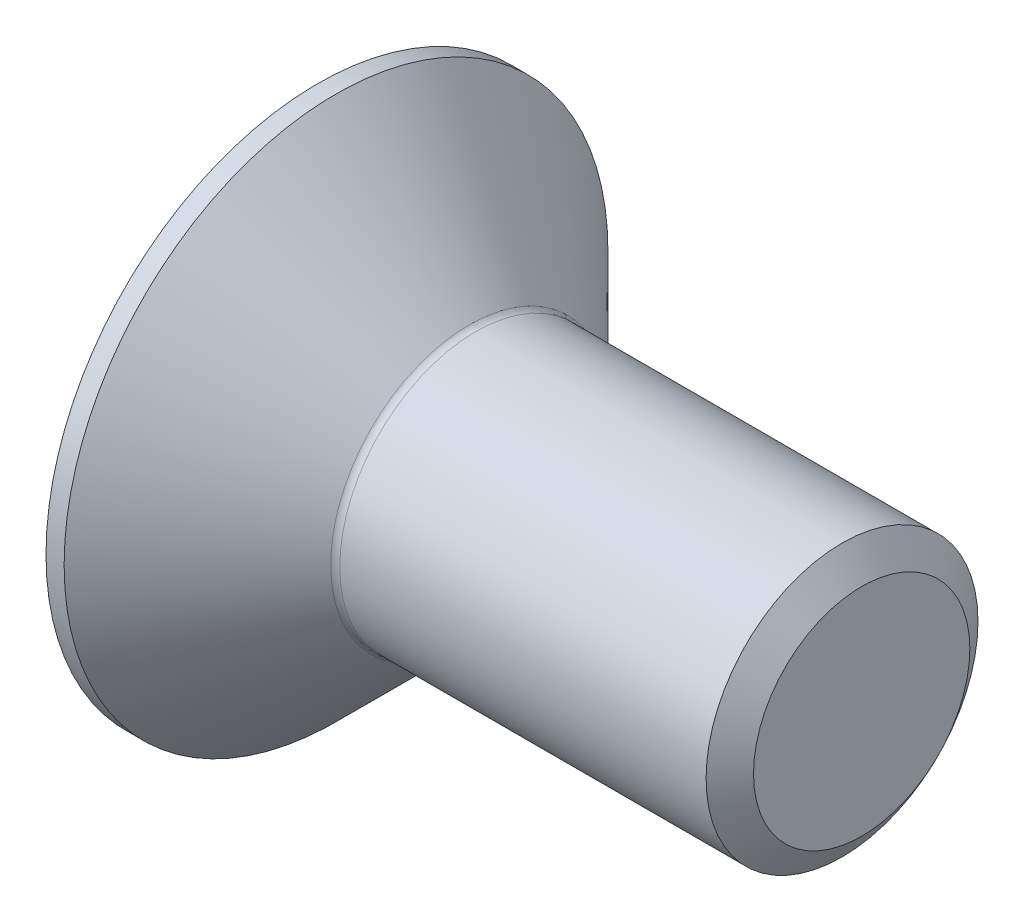
ISO-10303-21;
HEADER;
FILE_DESCRIPTION(('STEP AP214'),'2;1');
FILE_NAME('part.step','',(''),(''),'','','');
FILE_SCHEMA(('AUTOMOTIVE_DESIGN { 1 0 10303 214 1 1 1 1 }'));
ENDSEC;
DATA;
#1=APPLICATION_CONTEXT('core data for automotive mechanical design processes');
#2=APPLICATION_PROTOCOL_DEFINITION('international standard','automotive_design',2000,#1);
#3=PRODUCT_CONTEXT('',#1,'mechanical');
#4=PRODUCT('Part','Part','',(#3));
#5=PRODUCT_RELATED_PRODUCT_CATEGORY('part','',(#4));
#6=PRODUCT_DEFINITION_FORMATION('','',#4);
#7=PRODUCT_DEFINITION_CONTEXT('part definition',#1,'design');
#8=PRODUCT_DEFINITION('design','',#6,#7);
#9=PRODUCT_DEFINITION_SHAPE('','',#8);
#10=(LENGTH_UNIT() NAMED_UNIT(*) SI_UNIT(.MILLI.,.METRE.));
#11=(NAMED_UNIT(*) PLANE_ANGLE_UNIT() SI_UNIT($,.RADIAN.));
#12=(NAMED_UNIT(*) SI_UNIT($,.STERADIAN.) SOLID_ANGLE_UNIT());
#13=UNCERTAINTY_MEASURE_WITH_UNIT(LENGTH_MEASURE(1.E-05),#10,'distance_accuracy_value','');
#14=(GEOMETRIC_REPRESENTATION_CONTEXT(3) GLOBAL_UNCERTAINTY_ASSIGNED_CONTEXT((#13)) GLOBAL_UNIT_ASSIGNED_CONTEXT((#10,
#11,#12)) REPRESENTATION_CONTEXT('',''));
#15=CARTESIAN_POINT('',(0.,0.,0.));
#16=DIRECTION('',(0.,0.,1.));
#17=DIRECTION('',(1.,0.,0.));
#18=AXIS2_PLACEMENT_3D('',#15,#16,#17);
#19=CARTESIAN_POINT('',(1.480072615584,0.,0.));
#20=DIRECTION('',(-1.,0.,0.));
#21=DIRECTION('',(0.,0.,-1.));
#22=AXIS2_PLACEMENT_3D('',#19,#20,#21);
#23=CONICAL_SURFACE('',#22,0.5049,1.0471975511964);
#24=CARTESIAN_POINT('',(1.2,0.,0.));
#25=DIRECTION('',(1.,0.,0.));
#26=DIRECTION('',(0.,0.,1.));
#27=AXIS2_PLACEMENT_3D('',#24,#25,#26);
#28=CIRCLE('',#27,0.99);
#29=CARTESIAN_POINT('',(1.2,0.,0.99));
#30=VERTEX_POINT('',#29);
#31=EDGE_CURVE('E194',#30,#30,#28,.T.);
#32=ORIENTED_EDGE('',*,*,#31,.F.);
#33=EDGE_LOOP('',(#32));
#34=FACE_BOUND('',#33,.T.);
#35=CARTESIAN_POINT('',(1.771576766498,0.,0.));
#36=VERTEX_POINT('',#35);
#37=VERTEX_LOOP('',#36);
#38=FACE_BOUND('',#37,.T.);
#39=ADVANCED_FACE('F17',(#34,#38),#23,.F.);
#40=CARTESIAN_POINT('',(1.2,0.,0.));
#41=DIRECTION('',(1.,0.,0.));
#42=DIRECTION('',(0.,1.,0.));
#43=AXIS2_PLACEMENT_3D('',#40,#41,#42);
#44=PLANE('',#43);
#45=DIRECTION('',(0.,-0.498487739753809,-0.866896748935615));
#46=VECTOR('',#45,1.);
#47=CARTESIAN_POINT('',(1.2,1.15469877967,0.002015331603751));
#48=LINE('',#47,#46);
#49=CARTESIAN_POINT('',(1.2,1.15469877967,0.002015331603751));
#50=VERTEX_POINT('',#49);
#51=CARTESIAN_POINT('',(1.2,0.579094718201,-0.9989908111114));
#52=VERTEX_POINT('',#51);
#53=EDGE_CURVE('E11',#50,#52,#48,.T.);
#54=ORIENTED_EDGE('',*,*,#53,.T.);
#55=DIRECTION('',(0.,0.999998476913288,0.00174532836589698));
#56=VECTOR('',#55,1.);
#57=CARTESIAN_POINT('',(1.2,-0.5756040614692,-1.001006142715));
#58=LINE('',#57,#56);
#59=CARTESIAN_POINT('',(1.2,-0.5756040614692,-1.001006142715));
#60=VERTEX_POINT('',#59);
#61=EDGE_CURVE('E91',#60,#52,#58,.T.);
#62=ORIENTED_EDGE('',*,*,#61,.F.);
#63=DIRECTION('',(0.,-0.501510737159491,0.865151420569685));
#64=VECTOR('',#63,1.);
#65=CARTESIAN_POINT('',(1.2,-0.5756040614692,-1.001006142715));
#66=LINE('',#65,#64);
#67=CARTESIAN_POINT('',(1.2,-1.15469877967,-0.002015331603752));
#68=VERTEX_POINT('',#67);
#69=EDGE_CURVE('E32',#60,#68,#66,.T.);
#70=ORIENTED_EDGE('',*,*,#69,.T.);
#71=DIRECTION('',(0.,0.498487739753809,0.866896748935615));
#72=VECTOR('',#71,1.);
#73=CARTESIAN_POINT('',(1.2,-1.15469877967,-0.002015331603752));
#74=LINE('',#73,#72);
#75=CARTESIAN_POINT('',(1.2,-0.579094718201,0.9989908111114));
#76=VERTEX_POINT('',#75);
#77=EDGE_CURVE('E205',#68,#76,#74,.T.);
#78=ORIENTED_EDGE('',*,*,#77,.T.);
#79=DIRECTION('',(0.,-0.999998476913288,-0.00174532836589698));
#80=VECTOR('',#79,1.);
#81=CARTESIAN_POINT('',(1.2,0.5756040614692,1.001006142715));
#82=LINE('',#81,#80);
#83=CARTESIAN_POINT('',(1.2,0.5756040614692,1.001006142715));
#84=VERTEX_POINT('',#83);
#85=EDGE_CURVE('E106',#84,#76,#82,.T.);
#86=ORIENTED_EDGE('',*,*,#85,.F.);
#87=DIRECTION('',(0.,0.501510737159491,-0.865151420569685));
#88=VECTOR('',#87,1.);
#89=CARTESIAN_POINT('',(1.2,0.5756040614692,1.001006142715));
#90=LINE('',#89,#88);
#91=EDGE_CURVE('E201',#84,#50,#90,.T.);
#92=ORIENTED_EDGE('',*,*,#91,.T.);
#93=EDGE_LOOP('',(#54,#62,#70,#78,#86,#92));
#94=FACE_BOUND('',#93,.T.);
#95=ORIENTED_EDGE('',*,*,#31,.T.);
#96=EDGE_LOOP('',(#95));
#97=FACE_BOUND('',#96,.T.);
#98=ADVANCED_FACE('F211',(#94,#97),#44,.F.);
#99=CARTESIAN_POINT('',(0.,0.5756040614692,1.001006142715));
#100=DIRECTION('',(0.,0.865151420569685,0.501510737159491));
#101=DIRECTION('',(1.,0.,0.));
#102=AXIS2_PLACEMENT_3D('',#99,#100,#101);
#103=PLANE('',#102);
#104=DIRECTION('',(-1.,0.,0.));
#105=VECTOR('',#104,1.);
#106=CARTESIAN_POINT('',(1.2,1.15469877967,0.002015331603751));
#107=LINE('',#106,#105);
#108=CARTESIAN_POINT('',(0.0577350269188932,1.15469877967005,0.00201533160380936));
#109=VERTEX_POINT('',#108);
#110=EDGE_CURVE('E101',#50,#109,#107,.T.);
#111=ORIENTED_EDGE('',*,*,#110,.F.);
#112=ORIENTED_EDGE('',*,*,#91,.F.);
#113=DIRECTION('',(-1.,0.,0.));
#114=VECTOR('',#113,1.);
#115=CARTESIAN_POINT('',(1.2,0.5756040614692,1.001006142715));
#116=LINE('',#115,#114);
#117=CARTESIAN_POINT('',(0.057735026918927,0.575604061469208,1.00100614271499));
#118=VERTEX_POINT('',#117);
#119=EDGE_CURVE('E189',#84,#118,#116,.T.);
#120=ORIENTED_EDGE('',*,*,#119,.T.);
#121=CARTESIAN_POINT('',(0.0577350269188477,1.15469877967009,0.00201533160386764));
#122=CARTESIAN_POINT('',(0.077559727233772,1.13479498406907,0.0363511807952168));
#123=CARTESIAN_POINT('',(0.0962199932947419,1.11455843799374,0.0712610546767922));
#124=CARTESIAN_POINT('',(0.130386150043151,1.073294043532,0.142445870558753));
#125=CARTESIAN_POINT('',(0.145873036943601,1.05226227304212,0.178727578542655));
#126=CARTESIAN_POINT('',(0.172401986583303,1.00985265669143,0.251888005853613));
#127=CARTESIAN_POINT('',(0.183510714367633,0.988485606753085,0.288748101237095));
#128=CARTESIAN_POINT('',(0.200626540027817,0.945281567159923,0.363278980556008));
#129=CARTESIAN_POINT('',(0.206646407098901,0.923445895568999,0.4009474907119));
#130=CARTESIAN_POINT('',(0.212076142182217,0.885809051785995,0.465874453291107));
#131=CARTESIAN_POINT('',(0.212878460008744,0.870056755404791,0.493048590516207));
#132=CARTESIAN_POINT('',(0.21152624718964,0.83858272357361,0.547344144593532));
#133=CARTESIAN_POINT('',(0.209371063384536,0.822860995642601,0.574465548474855));
#134=CARTESIAN_POINT('',(0.198611707237915,0.775920436563805,0.655442262152752));
#135=CARTESIAN_POINT('',(0.185712518726653,0.74493527327832,0.708894473734209));
#136=CARTESIAN_POINT('',(0.154597346322252,0.690575940470048,0.802669243675655));
#137=CARTESIAN_POINT('',(0.138018039193724,0.666945904222823,0.843433195297489));
#138=CARTESIAN_POINT('',(0.10067374195193,0.620610608753016,0.923365774458743));
#139=CARTESIAN_POINT('',(0.0799223772754691,0.597902621140093,0.962539108718486));
#140=CARTESIAN_POINT('',(0.057735026918894,0.575604061469216,1.00100614271497));
#141=B_SPLINE_CURVE_WITH_KNOTS('',3,(#121,#122,#123,#124,#125,#126,#127,#128,#129,#130,#131,
#132,#133,#134,#135,#136,#137,#138,#139,#140),.UNSPECIFIED.,.F.,.F.,(4,2,2,2,2,2,2,2,2,4),(0.,
0.133182946580626,0.267141541466163,0.398973326814598,0.530473323702635,0.624596460448177,
0.718740387482565,0.907081600587103,1.05673041329857,1.20589820623488),.UNSPECIFIED.);
#142=EDGE_CURVE('E118',#109,#118,#141,.T.);
#143=ORIENTED_EDGE('',*,*,#142,.F.);
#144=EDGE_LOOP('',(#111,#112,#120,#143));
#145=FACE_BOUND('',#144,.T.);
#146=ADVANCED_FACE('F215',(#145),#103,.F.);
#147=CARTESIAN_POINT('',(0.10622119061,0.,0.));
#148=DIRECTION('',(-1.,0.,0.));
#149=DIRECTION('',(0.,0.,-1.));
#150=AXIS2_PLACEMENT_3D('',#147,#148,#149);
#151=CONICAL_SURFACE('',#150,1.106214374688,0.7853981633973);
#152=CARTESIAN_POINT('',(0.05773502691896,-0.5756040614692,-1.001006142715));
#153=CARTESIAN_POINT('',(0.07118968526329,-0.5486947857658,-1.000959177121));
#154=CARTESIAN_POINT('',(0.09614732009917,-0.495942137485,-1.000867106288));
#155=CARTESIAN_POINT('',(0.1276733223624,-0.4204644424806,-1.000735372725));
#156=CARTESIAN_POINT('',(0.1539245365825,-0.3475119025953,-1.000608046394));
#157=CARTESIAN_POINT('',(0.1751905707173,-0.2764847830984,-1.000484080559));
#158=CARTESIAN_POINT('',(0.1917452179942,-0.20647649285,-1.000361892918));
#159=CARTESIAN_POINT('',(0.203586614247,-0.137282448769,-1.000241126406));
#160=CARTESIAN_POINT('',(0.2107470808932,-0.06856622754632,-1.000121193853));
#161=CARTESIAN_POINT('',(0.2123941972009,-0.02282948491354,-1.000041368097));
#162=CARTESIAN_POINT('',(0.2124340422092,0.,-1.000001523089));
#163=B_SPLINE_CURVE_WITH_KNOTS('',3,(#152,#153,#154,#155,#156,#157,#158,#159,#160,#161,#162),
.UNSPECIFIED.,.F.,.F.,(4,1,1,1,1,1,1,1,4),(0.,0.125,0.25,0.375,0.5,0.625,0.75,0.875,1.),.UNSPECIFIED.);
#164=CARTESIAN_POINT('',(0.057735026918927,-0.575604061469208,-1.00100614271499));
#165=VERTEX_POINT('',#164);
#166=CARTESIAN_POINT('',(0.2124340422092,0.,-1.000001523089));
#167=VERTEX_POINT('',#166);
#168=EDGE_CURVE('E84',#165,#167,#163,.T.);
#169=ORIENTED_EDGE('',*,*,#168,.T.);
#170=CARTESIAN_POINT('',(0.2124340422092,0.,-1.000001523089));
#171=CARTESIAN_POINT('',(0.2124741423863,0.02297568572132,-0.999961422912));
#172=CARTESIAN_POINT('',(0.2109670804407,0.06900195194868,-0.9998810918416));
#173=CARTESIAN_POINT('',(0.2039553097016,0.1381456082402,-0.9997604132731));
#174=CARTESIAN_POINT('',(0.1922040935389,0.207754728814,-0.9996389223154));
#175=CARTESIAN_POINT('',(0.1756788116017,0.278185440732,-0.9995159974088));
#176=CARTESIAN_POINT('',(0.1543866020178,0.34962738603,-0.9993913075653));
#177=CARTESIAN_POINT('',(0.1280502319764,0.4230088263277,-0.9992632326609));
#178=CARTESIAN_POINT('',(0.09637834225902,0.4989345562618,-0.9991307171289));
#179=CARTESIAN_POINT('',(0.07127465250391,0.5520155082751,-0.9990380732966));
#180=CARTESIAN_POINT('',(0.05773502691896,0.579094718201,-0.9989908111114));
#181=B_SPLINE_CURVE_WITH_KNOTS('',3,(#170,#171,#172,#173,#174,#175,#176,#177,#178,#179,#180),
.UNSPECIFIED.,.F.,.F.,(4,1,1,1,1,1,1,1,4),(0.,0.125,0.25,0.375,0.5,0.625,0.75,0.875,1.),.UNSPECIFIED.);
#182=CARTESIAN_POINT('',(0.0577350269189231,0.579094718200948,-0.998990811111349));
#183=VERTEX_POINT('',#182);
#184=EDGE_CURVE('E89',#167,#183,#181,.T.);
#185=ORIENTED_EDGE('',*,*,#184,.T.);
#186=CARTESIAN_POINT('',(0.0577350269188862,0.579094718200895,-0.998990811111297));
#187=CARTESIAN_POINT('',(0.0775597272338172,0.598878538060608,-0.964585693893403));
#188=CARTESIAN_POINT('',(0.0962199932947937,0.618993102647303,-0.929605393966522));
#189=CARTESIAN_POINT('',(0.130386150043215,0.660008764333935,-0.85827697214988));
#190=CARTESIAN_POINT('',(0.145873036943672,0.680913759895748,-0.821922070627128));
#191=CARTESIAN_POINT('',(0.172401986583384,0.72306774032342,-0.748614051847181));
#192=CARTESIAN_POINT('',(0.183510714367719,0.744305994342267,-0.711679596104901));
#193=CARTESIAN_POINT('',(0.200626540027911,0.787249609402265,-0.636998360611646));
#194=CARTESIAN_POINT('',(0.206646407098998,0.808953660324521,-0.59925385922726));
#195=CARTESIAN_POINT('',(0.212076142182316,0.846363637417177,-0.534195915103305));
#196=CARTESIAN_POINT('',(0.212878460008844,0.862020982389435,-0.506966957656694));
#197=CARTESIAN_POINT('',(0.211526247189741,0.893305295617358,-0.452561869492713));
#198=CARTESIAN_POINT('',(0.209371063384639,0.908932256399376,-0.425385751772412));
#199=CARTESIAN_POINT('',(0.19861170723802,0.955589868020014,-0.34424567830339));
#200=CARTESIAN_POINT('',(0.185712518726761,0.986388259495271,-0.290685633967027));
#201=CARTESIAN_POINT('',(0.154597346322356,1.04041992609448,-0.196721685851553));
#202=CARTESIAN_POINT('',(0.13801803919382,1.06390752563403,-0.155875498358174));
#203=CARTESIAN_POINT('',(0.100673741952005,1.1099635220428,-0.0757816658087999));
#204=CARTESIAN_POINT('',(0.0799223772755318,1.13253463085623,-0.036529304537298));
#205=CARTESIAN_POINT('',(0.0577350269189434,1.15469877967,0.00201533160374308));
#206=B_SPLINE_CURVE_WITH_KNOTS('',3,(#186,#187,#188,#189,#190,#191,#192,#193,#194,#195,#196,
#197,#198,#199,#200,#201,#202,#203,#204,#205),.UNSPECIFIED.,.F.,.F.,(4,2,2,2,2,2,2,2,2,4),(0.,
0.133182946580649,0.26714154146621,0.398973326814668,0.530473323702727,0.624596460448261,
0.718740387482642,0.907081600587164,1.0567304132987,1.20589820623508),.UNSPECIFIED.);
#207=EDGE_CURVE('E111',#183,#109,#206,.T.);
#208=ORIENTED_EDGE('',*,*,#207,.T.);
#209=ORIENTED_EDGE('',*,*,#142,.T.);
#210=CARTESIAN_POINT('',(0.05773502691896,0.5756040614692,1.001006142715));
#211=CARTESIAN_POINT('',(0.07118968526329,0.5486947857658,1.000959177121));
#212=CARTESIAN_POINT('',(0.09614732009917,0.495942137485,1.000867106288));
#213=CARTESIAN_POINT('',(0.1276733223624,0.4204644424806,1.000735372725));
#214=CARTESIAN_POINT('',(0.1539245365825,0.3475119025953,1.000608046394));
#215=CARTESIAN_POINT('',(0.1751905707173,0.2764847830984,1.000484080559));
#216=CARTESIAN_POINT('',(0.1917452179942,0.20647649285,1.000361892918));
#217=CARTESIAN_POINT('',(0.203586614247,0.137282448769,1.000241126406));
#218=CARTESIAN_POINT('',(0.2107470808932,0.06856622754629,1.000121193853));
#219=CARTESIAN_POINT('',(0.2123941972009,0.02282948491353,1.000041368097));
#220=CARTESIAN_POINT('',(0.2124340422092,0.,1.000001523089));
#221=B_SPLINE_CURVE_WITH_KNOTS('',3,(#210,#211,#212,#213,#214,#215,#216,#217,#218,#219,#220),
.UNSPECIFIED.,.F.,.F.,(4,1,1,1,1,1,1,1,4),(0.,0.125,0.25,0.375,0.5,0.625,0.75,0.875,1.),.UNSPECIFIED.);
#222=CARTESIAN_POINT('',(0.2124340422092,0.,1.000001523089));
#223=VERTEX_POINT('',#222);
#224=EDGE_CURVE('E143',#118,#223,#221,.T.);
#225=ORIENTED_EDGE('',*,*,#224,.T.);
#226=CARTESIAN_POINT('',(0.2124340422092,0.,1.000001523089));
#227=CARTESIAN_POINT('',(0.2124741423863,-0.02297568572133,0.999961422912));
#228=CARTESIAN_POINT('',(0.2109670804407,-0.0690019519487,0.9998810918416));
#229=CARTESIAN_POINT('',(0.2039553097016,-0.1381456082402,0.9997604132731));
#230=CARTESIAN_POINT('',(0.1922040935389,-0.207754728814,0.9996389223154));
#231=CARTESIAN_POINT('',(0.1756788116017,-0.278185440732,0.9995159974088));
#232=CARTESIAN_POINT('',(0.1543866020178,-0.34962738603,0.9993913075653));
#233=CARTESIAN_POINT('',(0.1280502319764,-0.4230088263277,0.9992632326609));
#234=CARTESIAN_POINT('',(0.09637834225902,-0.4989345562618,0.9991307171289));
#235=CARTESIAN_POINT('',(0.07127465250391,-0.5520155082751,0.9990380732966));
#236=CARTESIAN_POINT('',(0.05773502691896,-0.579094718201,0.9989908111114));
#237=B_SPLINE_CURVE_WITH_KNOTS('',3,(#226,#227,#228,#229,#230,#231,#232,#233,#234,#235,#236),
.UNSPECIFIED.,.F.,.F.,(4,1,1,1,1,1,1,1,4),(0.,0.125,0.25,0.375,0.5,0.625,0.75,0.875,1.),.UNSPECIFIED.);
#238=CARTESIAN_POINT('',(0.0577350269189231,-0.579094718200948,0.998990811111349));
#239=VERTEX_POINT('',#238);
#240=EDGE_CURVE('E142',#223,#239,#237,.T.);
#241=ORIENTED_EDGE('',*,*,#240,.T.);
#242=CARTESIAN_POINT('',(0.0577350269188862,-0.579094718200895,0.998990811111297));
#243=CARTESIAN_POINT('',(0.0775597272338172,-0.598878538060608,0.964585693893403));
#244=CARTESIAN_POINT('',(0.0962199932947937,-0.618993102647303,0.929605393966522));
#245=CARTESIAN_POINT('',(0.130386150043215,-0.660008764333935,0.85827697214988));
#246=CARTESIAN_POINT('',(0.145873036943672,-0.680913759895748,0.821922070627128));
#247=CARTESIAN_POINT('',(0.172401986583384,-0.72306774032342,0.748614051847181));
#248=CARTESIAN_POINT('',(0.183510714367719,-0.744305994342267,0.711679596104901));
#249=CARTESIAN_POINT('',(0.200626540027911,-0.787249609402265,0.636998360611646));
#250=CARTESIAN_POINT('',(0.206646407098998,-0.808953660324521,0.59925385922726));
#251=CARTESIAN_POINT('',(0.212076142182316,-0.846363637417177,0.534195915103305));
#252=CARTESIAN_POINT('',(0.212878460008844,-0.862020982389435,0.506966957656694));
#253=CARTESIAN_POINT('',(0.211526247189741,-0.893305295617358,0.452561869492713));
#254=CARTESIAN_POINT('',(0.209371063384639,-0.908932256399376,0.425385751772412));
#255=CARTESIAN_POINT('',(0.19861170723802,-0.955589868020014,0.34424567830339));
#256=CARTESIAN_POINT('',(0.185712518726761,-0.986388259495271,0.290685633967027));
#257=CARTESIAN_POINT('',(0.154597346322356,-1.04041992609448,0.196721685851553));
#258=CARTESIAN_POINT('',(0.13801803919382,-1.06390752563403,0.155875498358174));
#259=CARTESIAN_POINT('',(0.100673741952005,-1.1099635220428,0.0757816658087999));
#260=CARTESIAN_POINT('',(0.0799223772755318,-1.13253463085623,0.036529304537298));
#261=CARTESIAN_POINT('',(0.0577350269189434,-1.15469877967,-0.00201533160374308));
#262=B_SPLINE_CURVE_WITH_KNOTS('',3,(#242,#243,#244,#245,#246,#247,#248,#249,#250,#251,#252,
#253,#254,#255,#256,#257,#258,#259,#260,#261),.UNSPECIFIED.,.F.,.F.,(4,2,2,2,2,2,2,2,2,4),(0.,
0.133182946580649,0.26714154146621,0.398973326814668,0.530473323702727,0.624596460448261,
0.718740387482642,0.907081600587164,1.0567304132987,1.20589820623508),.UNSPECIFIED.);
#263=CARTESIAN_POINT('',(0.0577350269188955,-1.15469877967004,-0.00201533160380539));
#264=VERTEX_POINT('',#263);
#265=EDGE_CURVE('E96',#239,#264,#262,.T.);
#266=ORIENTED_EDGE('',*,*,#265,.T.);
#267=CARTESIAN_POINT('',(0.0577350269188477,-1.15469877967009,-0.00201533160386764));
#268=CARTESIAN_POINT('',(0.077559727233772,-1.13479498406907,-0.0363511807952168));
#269=CARTESIAN_POINT('',(0.0962199932947419,-1.11455843799374,-0.0712610546767922));
#270=CARTESIAN_POINT('',(0.130386150043151,-1.073294043532,-0.142445870558753));
#271=CARTESIAN_POINT('',(0.145873036943601,-1.05226227304212,-0.178727578542655));
#272=CARTESIAN_POINT('',(0.172401986583303,-1.00985265669143,-0.251888005853613));
#273=CARTESIAN_POINT('',(0.183510714367633,-0.988485606753085,-0.288748101237095));
#274=CARTESIAN_POINT('',(0.200626540027817,-0.945281567159923,-0.363278980556008));
#275=CARTESIAN_POINT('',(0.206646407098901,-0.923445895568999,-0.4009474907119));
#276=CARTESIAN_POINT('',(0.212076142182217,-0.885809051785995,-0.465874453291107));
#277=CARTESIAN_POINT('',(0.212878460008744,-0.870056755404791,-0.493048590516207));
#278=CARTESIAN_POINT('',(0.21152624718964,-0.83858272357361,-0.547344144593532));
#279=CARTESIAN_POINT('',(0.209371063384536,-0.822860995642601,-0.574465548474855));
#280=CARTESIAN_POINT('',(0.198611707237915,-0.775920436563805,-0.655442262152752));
#281=CARTESIAN_POINT('',(0.185712518726653,-0.74493527327832,-0.708894473734209));
#282=CARTESIAN_POINT('',(0.154597346322252,-0.690575940470048,-0.802669243675655));
#283=CARTESIAN_POINT('',(0.138018039193724,-0.666945904222823,-0.843433195297489));
#284=CARTESIAN_POINT('',(0.10067374195193,-0.620610608753016,-0.923365774458743));
#285=CARTESIAN_POINT('',(0.0799223772754691,-0.597902621140093,-0.962539108718486));
#286=CARTESIAN_POINT('',(0.057735026918894,-0.575604061469216,-1.00100614271497));
#287=B_SPLINE_CURVE_WITH_KNOTS('',3,(#267,#268,#269,#270,#271,#272,#273,#274,#275,#276,#277,
#278,#279,#280,#281,#282,#283,#284,#285,#286),.UNSPECIFIED.,.F.,.F.,(4,2,2,2,2,2,2,2,2,4),(0.,
0.133182946580626,0.267141541466163,0.398973326814598,0.530473323702635,0.624596460448177,
0.718740387482565,0.907081600587103,1.05673041329857,1.20589820623488),.UNSPECIFIED.);
#288=EDGE_CURVE('E21',#264,#165,#287,.T.);
#289=ORIENTED_EDGE('',*,*,#288,.T.);
#290=EDGE_LOOP('',(#169,#185,#208,#209,#225,#241,#266,#289));
#291=FACE_BOUND('',#290,.T.);
#292=CARTESIAN_POINT('',(0.,0.,0.));
#293=DIRECTION('',(1.,0.,0.));
#294=DIRECTION('',(0.,0.,-1.));
#295=AXIS2_PLACEMENT_3D('',#292,#293,#294);
#296=CIRCLE('',#295,1.212435565298);
#297=CARTESIAN_POINT('',(0.,0.,-1.212435565298));
#298=VERTEX_POINT('',#297);
#299=EDGE_CURVE('E163',#298,#298,#296,.T.);
#300=ORIENTED_EDGE('',*,*,#299,.F.);
#301=EDGE_LOOP('',(#300));
#302=FACE_BOUND('',#301,.T.);
#303=ADVANCED_FACE('F93',(#291,#302),#151,.F.);
#304=CARTESIAN_POINT('',(0.,0.579094718201,-0.9989908111114));
#305=DIRECTION('',(0.,0.00174532836589798,-0.999998476913288));
#306=DIRECTION('',(-1.,0.,0.));
#307=AXIS2_PLACEMENT_3D('',#304,#305,#306);
#308=PLANE('',#307);
#309=DIRECTION('',(-1.,0.,0.));
#310=VECTOR('',#309,1.);
#311=CARTESIAN_POINT('',(1.2,-0.5756040614692,-1.001006142715));
#312=LINE('',#311,#310);
#313=EDGE_CURVE('E86',#60,#165,#312,.T.);
#314=ORIENTED_EDGE('',*,*,#313,.F.);
#315=ORIENTED_EDGE('',*,*,#61,.T.);
#316=DIRECTION('',(-1.,0.,0.));
#317=VECTOR('',#316,1.);
#318=CARTESIAN_POINT('',(1.2,0.579094718201,-0.9989908111114));
#319=LINE('',#318,#317);
#320=EDGE_CURVE('E104',#52,#183,#319,.T.);
#321=ORIENTED_EDGE('',*,*,#320,.T.);
#322=ORIENTED_EDGE('',*,*,#184,.F.);
#323=ORIENTED_EDGE('',*,*,#168,.F.);
#324=EDGE_LOOP('',(#314,#315,#321,#322,#323));
#325=FACE_BOUND('',#324,.T.);
#326=ADVANCED_FACE('F85',(#325),#308,.F.);
#327=CARTESIAN_POINT('',(0.,1.15469877967,0.002015331603751));
#328=DIRECTION('',(0.,0.866896748935615,-0.498487739753809));
#329=DIRECTION('',(-1.,0.,0.));
#330=AXIS2_PLACEMENT_3D('',#327,#328,#329);
#331=PLANE('',#330);
#332=ORIENTED_EDGE('',*,*,#320,.F.);
#333=ORIENTED_EDGE('',*,*,#53,.F.);
#334=ORIENTED_EDGE('',*,*,#110,.T.);
#335=ORIENTED_EDGE('',*,*,#207,.F.);
#336=EDGE_LOOP('',(#332,#333,#334,#335));
#337=FACE_BOUND('',#336,.T.);
#338=ADVANCED_FACE('F125',(#337),#331,.F.);
#339=CARTESIAN_POINT('',(0.,-0.5756040614692,-1.001006142715));
#340=DIRECTION('',(0.,-0.865151420569685,-0.501510737159491));
#341=DIRECTION('',(0.,0.501510737159491,-0.865151420569685));
#342=AXIS2_PLACEMENT_3D('',#339,#340,#341);
#343=PLANE('',#342);
#344=DIRECTION('',(-1.,0.,0.));
#345=VECTOR('',#344,1.);
#346=CARTESIAN_POINT('',(1.2,-1.15469877967,-0.002015331603752));
#347=LINE('',#346,#345);
#348=EDGE_CURVE('E102',#68,#264,#347,.T.);
#349=ORIENTED_EDGE('',*,*,#348,.F.);
#350=ORIENTED_EDGE('',*,*,#69,.F.);
#351=ORIENTED_EDGE('',*,*,#313,.T.);
#352=ORIENTED_EDGE('',*,*,#288,.F.);
#353=EDGE_LOOP('',(#349,#350,#351,#352));
#354=FACE_BOUND('',#353,.T.);
#355=ADVANCED_FACE('F99',(#354),#343,.F.);
#356=CARTESIAN_POINT('',(0.,-1.15469877967,-0.002015331603751));
#357=DIRECTION('',(0.,-0.866896748935615,0.498487739753809));
#358=DIRECTION('',(-1.,0.,0.));
#359=AXIS2_PLACEMENT_3D('',#356,#357,#358);
#360=PLANE('',#359);
#361=DIRECTION('',(-1.,0.,0.));
#362=VECTOR('',#361,1.);
#363=CARTESIAN_POINT('',(1.2,-0.579094718201,0.9989908111114));
#364=LINE('',#363,#362);
#365=EDGE_CURVE('E154',#76,#239,#364,.T.);
#366=ORIENTED_EDGE('',*,*,#365,.F.);
#367=ORIENTED_EDGE('',*,*,#77,.F.);
#368=ORIENTED_EDGE('',*,*,#348,.T.);
#369=ORIENTED_EDGE('',*,*,#265,.F.);
#370=EDGE_LOOP('',(#366,#367,#368,#369));
#371=FACE_BOUND('',#370,.T.);
#372=ADVANCED_FACE('F132',(#371),#360,.F.);
#373=CARTESIAN_POINT('',(0.,-0.579094718201,0.9989908111114));
#374=DIRECTION('',(0.,-0.00174532836589798,0.999998476913288));
#375=DIRECTION('',(-1.,0.,0.));
#376=AXIS2_PLACEMENT_3D('',#373,#374,#375);
#377=PLANE('',#376);
#378=ORIENTED_EDGE('',*,*,#119,.F.);
#379=ORIENTED_EDGE('',*,*,#85,.T.);
#380=ORIENTED_EDGE('',*,*,#365,.T.);
#381=ORIENTED_EDGE('',*,*,#240,.F.);
#382=ORIENTED_EDGE('',*,*,#224,.F.);
#383=EDGE_LOOP('',(#378,#379,#380,#381,#382));
#384=FACE_BOUND('',#383,.T.);
#385=ADVANCED_FACE('F136',(#384),#377,.F.);
#386=CARTESIAN_POINT('',(0.,0.,-2.106217782649));
#387=DIRECTION('',(-1.,0.,0.));
#388=DIRECTION('',(0.,0.,1.));
#389=AXIS2_PLACEMENT_3D('',#386,#387,#388);
#390=PLANE('',#389);
#391=CARTESIAN_POINT('',(0.,0.,0.));
#392=DIRECTION('',(-1.,0.,0.));
#393=DIRECTION('',(0.,0.,1.));
#394=AXIS2_PLACEMENT_3D('',#391,#392,#393);
#395=CIRCLE('',#394,3.);
#396=CARTESIAN_POINT('',(0.,0.,3.));
#397=VERTEX_POINT('',#396);
#398=EDGE_CURVE('E158',#397,#397,#395,.T.);
#399=ORIENTED_EDGE('',*,*,#398,.T.);
#400=EDGE_LOOP('',(#399));
#401=FACE_BOUND('',#400,.T.);
#402=ORIENTED_EDGE('',*,*,#299,.T.);
#403=EDGE_LOOP('',(#402));
#404=FACE_BOUND('',#403,.T.);
#405=ADVANCED_FACE('F217',(#401,#404),#390,.T.);
#406=CARTESIAN_POINT('',(0.1,0.,0.));
#407=DIRECTION('',(1.,0.,0.));
#408=DIRECTION('',(0.,0.,-1.));
#409=AXIS2_PLACEMENT_3D('',#406,#407,#408);
#410=CYLINDRICAL_SURFACE('',#409,3.);
#411=CARTESIAN_POINT('',(0.2,0.,0.));
#412=DIRECTION('',(1.,0.,0.));
#413=DIRECTION('',(0.,0.,1.));
#414=AXIS2_PLACEMENT_3D('',#411,#412,#413);
#415=CIRCLE('',#414,3.);
#416=CARTESIAN_POINT('',(0.2,0.,3.));
#417=VERTEX_POINT('',#416);
#418=EDGE_CURVE('E168',#417,#417,#415,.T.);
#419=ORIENTED_EDGE('',*,*,#418,.F.);
#420=EDGE_LOOP('',(#419));
#421=FACE_BOUND('',#420,.T.);
#422=ORIENTED_EDGE('',*,*,#398,.F.);
#423=EDGE_LOOP('',(#422));
#424=FACE_BOUND('',#423,.T.);
#425=ADVANCED_FACE('F222',(#421,#424),#410,.T.);
#426=CARTESIAN_POINT('',(0.9353553390593,0.,0.));
#427=DIRECTION('',(-1.,0.,0.));
#428=DIRECTION('',(0.,0.,-1.));
#429=AXIS2_PLACEMENT_3D('',#426,#427,#428);
#430=CONICAL_SURFACE('',#429,2.264644660941,0.7853981633973);
#431=CARTESIAN_POINT('',(1.670710678119,0.,0.));
#432=DIRECTION('',(1.,0.,0.));
#433=DIRECTION('',(0.,0.,-1.));
#434=AXIS2_PLACEMENT_3D('',#431,#432,#433);
#435=CIRCLE('',#434,1.529289321881);
#436=CARTESIAN_POINT('',(1.670710678119,0.,-1.529289321881));
#437=VERTEX_POINT('',#436);
#438=EDGE_CURVE('E175',#437,#437,#435,.T.);
#439=ORIENTED_EDGE('',*,*,#438,.F.);
#440=EDGE_LOOP('',(#439));
#441=FACE_BOUND('',#440,.T.);
#442=ORIENTED_EDGE('',*,*,#418,.T.);
#443=EDGE_LOOP('',(#442));
#444=FACE_BOUND('',#443,.T.);
#445=ADVANCED_FACE('F276',(#441,#444),#430,.T.);
#446=CARTESIAN_POINT('',(1.741421356237,0.,0.));
#447=DIRECTION('',(-1.,0.,0.));
#448=DIRECTION('',(0.,0.,1.));
#449=AXIS2_PLACEMENT_3D('',#446,#447,#448);
#450=TOROIDAL_SURFACE('',#449,1.6,0.1);
#451=CARTESIAN_POINT('',(1.741421356237,0.,0.));
#452=DIRECTION('',(-1.,0.,0.));
#453=DIRECTION('',(0.,0.,-1.));
#454=AXIS2_PLACEMENT_3D('',#451,#452,#453);
#455=CIRCLE('',#454,1.5);
#456=CARTESIAN_POINT('',(1.741421356237,0.,-1.5));
#457=VERTEX_POINT('',#456);
#458=EDGE_CURVE('E174',#457,#457,#455,.T.);
#459=ORIENTED_EDGE('',*,*,#458,.T.);
#460=EDGE_LOOP('',(#459));
#461=FACE_BOUND('',#460,.T.);
#462=ORIENTED_EDGE('',*,*,#438,.T.);
#463=EDGE_LOOP('',(#462));
#464=FACE_BOUND('',#463,.T.);
#465=ADVANCED_FACE('F286',(#461,#464),#450,.F.);
#466=CARTESIAN_POINT('',(3.762346563902,0.,0.));
#467=DIRECTION('',(1.,0.,0.));
#468=DIRECTION('',(0.,0.,-1.));
#469=AXIS2_PLACEMENT_3D('',#466,#467,#468);
#470=CYLINDRICAL_SURFACE('',#469,1.5);
#471=CARTESIAN_POINT('',(5.783271771566,0.,0.));
#472=DIRECTION('',(1.,0.,0.));
#473=DIRECTION('',(0.,0.,-1.));
#474=AXIS2_PLACEMENT_3D('',#471,#472,#473);
#475=CIRCLE('',#474,1.5);
#476=CARTESIAN_POINT('',(5.783271771566,0.,-1.5));
#477=VERTEX_POINT('',#476);
#478=EDGE_CURVE('E178',#477,#477,#475,.T.);
#479=ORIENTED_EDGE('',*,*,#478,.F.);
#480=EDGE_LOOP('',(#479));
#481=FACE_BOUND('',#480,.T.);
#482=ORIENTED_EDGE('',*,*,#458,.F.);
#483=EDGE_LOOP('',(#482));
#484=FACE_BOUND('',#483,.T.);
#485=ADVANCED_FACE('F296',(#481,#484),#470,.T.);
#486=CARTESIAN_POINT('',(5.891635885783,0.,0.));
#487=DIRECTION('',(-1.,0.,0.));
#488=DIRECTION('',(0.,0.,-1.));
#489=AXIS2_PLACEMENT_3D('',#486,#487,#488);
#490=CONICAL_SURFACE('',#489,1.34675,0.95531661812441);
#491=CARTESIAN_POINT('',(6.,0.,0.));
#492=DIRECTION('',(1.,0.,0.));
#493=DIRECTION('',(0.,0.,1.));
#494=AXIS2_PLACEMENT_3D('',#491,#492,#493);
#495=CIRCLE('',#494,1.1935);
#496=CARTESIAN_POINT('',(6.,0.,1.1935));
#497=VERTEX_POINT('',#496);
#498=EDGE_CURVE('E183',#497,#497,#495,.T.);
#499=ORIENTED_EDGE('',*,*,#498,.F.);
#500=EDGE_LOOP('',(#499));
#501=FACE_BOUND('',#500,.T.);
#502=ORIENTED_EDGE('',*,*,#478,.T.);
#503=EDGE_LOOP('',(#502));
#504=FACE_BOUND('',#503,.T.);
#505=ADVANCED_FACE('F306',(#501,#504),#490,.T.);
#506=CARTESIAN_POINT('',(6.,0.,-0.59675));
#507=DIRECTION('',(1.,0.,0.));
#508=DIRECTION('',(0.,1.,0.));
#509=AXIS2_PLACEMENT_3D('',#506,#507,#508);
#510=PLANE('',#509);
#511=ORIENTED_EDGE('',*,*,#498,.T.);
#512=EDGE_LOOP('',(#511));
#513=FACE_BOUND('',#512,.T.);
#514=ADVANCED_FACE('F19',(#513),#510,.T.);
#515=CLOSED_SHELL('',(#39,#98,#146,#303,#326,#338,#355,#372,#385,#405,#425,#445,#465,#485,#505,#514));
#516=MANIFOLD_SOLID_BREP('B1',#515);
#517=ADVANCED_BREP_SHAPE_REPRESENTATION('',(#18,#516),#14);
#518=SHAPE_DEFINITION_REPRESENTATION(#9,#517);
ENDSEC;
END-ISO-10303-21;
